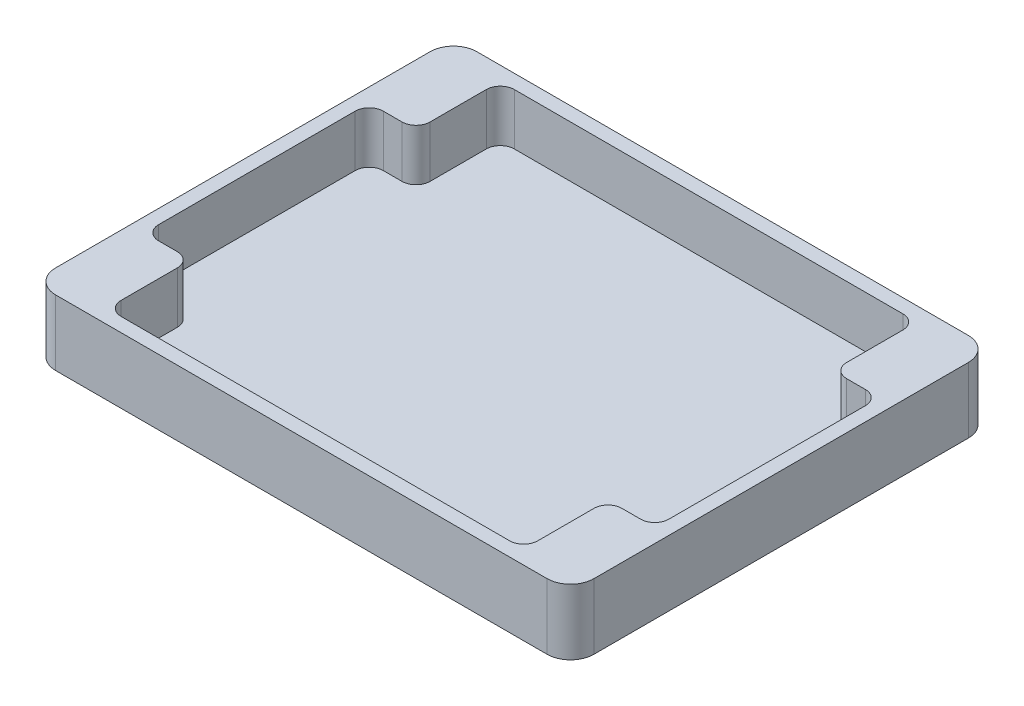
ISO-10303-21;
HEADER;
FILE_DESCRIPTION(('STEP AP214'),'2;1');
FILE_NAME('part.step','',(''),(''),'','','');
FILE_SCHEMA(('AUTOMOTIVE_DESIGN { 1 0 10303 214 1 1 1 1 }'));
ENDSEC;
DATA;
#1=APPLICATION_CONTEXT('core data for automotive mechanical design processes');
#2=APPLICATION_PROTOCOL_DEFINITION('international standard','automotive_design',2000,#1);
#3=PRODUCT_CONTEXT('',#1,'mechanical');
#4=PRODUCT('Part','Part','',(#3));
#5=PRODUCT_RELATED_PRODUCT_CATEGORY('part','',(#4));
#6=PRODUCT_DEFINITION_FORMATION('','',#4);
#7=PRODUCT_DEFINITION_CONTEXT('part definition',#1,'design');
#8=PRODUCT_DEFINITION('design','',#6,#7);
#9=PRODUCT_DEFINITION_SHAPE('','',#8);
#10=(LENGTH_UNIT() NAMED_UNIT(*) SI_UNIT(.MILLI.,.METRE.));
#11=(NAMED_UNIT(*) PLANE_ANGLE_UNIT() SI_UNIT($,.RADIAN.));
#12=(NAMED_UNIT(*) SI_UNIT($,.STERADIAN.) SOLID_ANGLE_UNIT());
#13=UNCERTAINTY_MEASURE_WITH_UNIT(LENGTH_MEASURE(1.E-05),#10,'distance_accuracy_value','');
#14=(GEOMETRIC_REPRESENTATION_CONTEXT(3) GLOBAL_UNCERTAINTY_ASSIGNED_CONTEXT((#13)) GLOBAL_UNIT_ASSIGNED_CONTEXT((#10,
#11,#12)) REPRESENTATION_CONTEXT('',''));
#15=CARTESIAN_POINT('',(0.,0.,0.));
#16=DIRECTION('',(0.,0.,1.));
#17=DIRECTION('',(1.,0.,0.));
#18=AXIS2_PLACEMENT_3D('',#15,#16,#17);
#19=CARTESIAN_POINT('',(0.,3.,0.));
#20=DIRECTION('',(0.,-1.,0.));
#21=DIRECTION('',(0.,0.,-1.));
#22=AXIS2_PLACEMENT_3D('',#19,#20,#21);
#23=PLANE('',#22);
#24=DIRECTION('',(-1.,0.,0.));
#25=VECTOR('',#24,1.);
#26=CARTESIAN_POINT('',(112.,3.,-21.));
#27=LINE('',#26,#25);
#28=CARTESIAN_POINT('',(109.,3.,-21.));
#29=VERTEX_POINT('',#28);
#30=CARTESIAN_POINT('',(105.,3.,-21.));
#31=VERTEX_POINT('',#30);
#32=EDGE_CURVE('E268',#29,#31,#27,.T.);
#33=ORIENTED_EDGE('',*,*,#32,.F.);
#34=CARTESIAN_POINT('',(109.,3.,-24.));
#35=DIRECTION('',(0.,-1.,0.));
#36=DIRECTION('',(0.,0.,-1.));
#37=AXIS2_PLACEMENT_3D('',#34,#35,#36);
#38=CIRCLE('',#37,3.);
#39=CARTESIAN_POINT('',(112.,3.,-24.));
#40=VERTEX_POINT('',#39);
#41=EDGE_CURVE('E507',#29,#40,#38,.F.);
#42=ORIENTED_EDGE('',*,*,#41,.T.);
#43=DIRECTION('',(0.,0.,-1.));
#44=VECTOR('',#43,1.);
#45=CARTESIAN_POINT('',(112.,3.,-3.));
#46=LINE('',#45,#44);
#47=CARTESIAN_POINT('',(112.,3.,-66.));
#48=VERTEX_POINT('',#47);
#49=EDGE_CURVE('E580',#40,#48,#46,.T.);
#50=ORIENTED_EDGE('',*,*,#49,.T.);
#51=CARTESIAN_POINT('',(109.,3.,-66.));
#52=DIRECTION('',(0.,-1.,0.));
#53=DIRECTION('',(0.,0.,-1.));
#54=AXIS2_PLACEMENT_3D('',#51,#52,#53);
#55=CIRCLE('',#54,3.);
#56=CARTESIAN_POINT('',(109.,3.,-69.));
#57=VERTEX_POINT('',#56);
#58=EDGE_CURVE('E495',#48,#57,#55,.F.);
#59=ORIENTED_EDGE('',*,*,#58,.T.);
#60=DIRECTION('',(1.,0.,0.));
#61=VECTOR('',#60,1.);
#62=CARTESIAN_POINT('',(112.,3.,-69.));
#63=LINE('',#62,#61);
#64=CARTESIAN_POINT('',(105.,3.,-69.));
#65=VERTEX_POINT('',#64);
#66=EDGE_CURVE('E542',#65,#57,#63,.T.);
#67=ORIENTED_EDGE('',*,*,#66,.F.);
#68=CARTESIAN_POINT('',(105.,3.,-72.));
#69=DIRECTION('',(0.,-1.,0.));
#70=DIRECTION('',(0.,0.,-1.));
#71=AXIS2_PLACEMENT_3D('',#68,#69,#70);
#72=CIRCLE('',#71,3.);
#73=CARTESIAN_POINT('',(102.,3.,-72.));
#74=VERTEX_POINT('',#73);
#75=EDGE_CURVE('E382',#65,#74,#72,.T.);
#76=ORIENTED_EDGE('',*,*,#75,.T.);
#77=DIRECTION('',(0.,0.,1.));
#78=VECTOR('',#77,1.);
#79=CARTESIAN_POINT('',(102.,3.,-87.));
#80=LINE('',#79,#78);
#81=CARTESIAN_POINT('',(102.,3.,-84.));
#82=VERTEX_POINT('',#81);
#83=EDGE_CURVE('E548',#82,#74,#80,.T.);
#84=ORIENTED_EDGE('',*,*,#83,.F.);
#85=CARTESIAN_POINT('',(99.,3.,-84.));
#86=DIRECTION('',(0.,-1.,0.));
#87=DIRECTION('',(0.,0.,-1.));
#88=AXIS2_PLACEMENT_3D('',#85,#86,#87);
#89=CIRCLE('',#88,3.);
#90=CARTESIAN_POINT('',(99.,3.,-87.));
#91=VERTEX_POINT('',#90);
#92=EDGE_CURVE('E492',#82,#91,#89,.F.);
#93=ORIENTED_EDGE('',*,*,#92,.T.);
#94=DIRECTION('',(-1.,0.,0.));
#95=VECTOR('',#94,1.);
#96=CARTESIAN_POINT('',(112.,3.,-87.));
#97=LINE('',#96,#95);
#98=CARTESIAN_POINT('',(16.,3.,-87.));
#99=VERTEX_POINT('',#98);
#100=EDGE_CURVE('E595',#91,#99,#97,.T.);
#101=ORIENTED_EDGE('',*,*,#100,.T.);
#102=CARTESIAN_POINT('',(16.,3.,-84.));
#103=DIRECTION('',(0.,-1.,0.));
#104=DIRECTION('',(0.,0.,-1.));
#105=AXIS2_PLACEMENT_3D('',#102,#103,#104);
#106=CIRCLE('',#105,3.);
#107=CARTESIAN_POINT('',(13.,3.,-84.));
#108=VERTEX_POINT('',#107);
#109=EDGE_CURVE('E489',#99,#108,#106,.F.);
#110=ORIENTED_EDGE('',*,*,#109,.T.);
#111=DIRECTION('',(0.,0.,-1.));
#112=VECTOR('',#111,1.);
#113=CARTESIAN_POINT('',(13.,3.,-87.));
#114=LINE('',#113,#112);
#115=CARTESIAN_POINT('',(13.,3.,-72.));
#116=VERTEX_POINT('',#115);
#117=EDGE_CURVE('E558',#116,#108,#114,.T.);
#118=ORIENTED_EDGE('',*,*,#117,.F.);
#119=CARTESIAN_POINT('',(10.,3.,-72.));
#120=DIRECTION('',(0.,-1.,0.));
#121=DIRECTION('',(0.,0.,-1.));
#122=AXIS2_PLACEMENT_3D('',#119,#120,#121);
#123=CIRCLE('',#122,3.);
#124=CARTESIAN_POINT('',(10.,3.,-69.));
#125=VERTEX_POINT('',#124);
#126=EDGE_CURVE('E394',#116,#125,#123,.T.);
#127=ORIENTED_EDGE('',*,*,#126,.T.);
#128=DIRECTION('',(1.,0.,0.));
#129=VECTOR('',#128,1.);
#130=CARTESIAN_POINT('',(3.,3.,-69.));
#131=LINE('',#130,#129);
#132=CARTESIAN_POINT('',(6.,3.,-69.));
#133=VERTEX_POINT('',#132);
#134=EDGE_CURVE('E553',#133,#125,#131,.T.);
#135=ORIENTED_EDGE('',*,*,#134,.F.);
#136=CARTESIAN_POINT('',(6.,3.,-66.));
#137=DIRECTION('',(0.,-1.,0.));
#138=DIRECTION('',(0.,0.,-1.));
#139=AXIS2_PLACEMENT_3D('',#136,#137,#138);
#140=CIRCLE('',#139,3.);
#141=CARTESIAN_POINT('',(3.,3.,-66.));
#142=VERTEX_POINT('',#141);
#143=EDGE_CURVE('E486',#133,#142,#140,.F.);
#144=ORIENTED_EDGE('',*,*,#143,.T.);
#145=DIRECTION('',(0.,0.,1.));
#146=VECTOR('',#145,1.);
#147=CARTESIAN_POINT('',(3.,3.,-87.));
#148=LINE('',#147,#146);
#149=CARTESIAN_POINT('',(3.,3.,-24.));
#150=VERTEX_POINT('',#149);
#151=EDGE_CURVE('E599',#142,#150,#148,.T.);
#152=ORIENTED_EDGE('',*,*,#151,.T.);
#153=CARTESIAN_POINT('',(6.,3.,-24.));
#154=DIRECTION('',(0.,-1.,0.));
#155=DIRECTION('',(0.,0.,-1.));
#156=AXIS2_PLACEMENT_3D('',#153,#154,#155);
#157=CIRCLE('',#156,3.);
#158=CARTESIAN_POINT('',(6.,3.,-21.));
#159=VERTEX_POINT('',#158);
#160=EDGE_CURVE('E498',#150,#159,#157,.F.);
#161=ORIENTED_EDGE('',*,*,#160,.T.);
#162=DIRECTION('',(-1.,0.,0.));
#163=VECTOR('',#162,1.);
#164=CARTESIAN_POINT('',(3.,3.,-21.));
#165=LINE('',#164,#163);
#166=CARTESIAN_POINT('',(10.,3.,-21.));
#167=VERTEX_POINT('',#166);
#168=EDGE_CURVE('E733',#167,#159,#165,.T.);
#169=ORIENTED_EDGE('',*,*,#168,.F.);
#170=CARTESIAN_POINT('',(10.,3.,-18.));
#171=DIRECTION('',(0.,-1.,0.));
#172=DIRECTION('',(0.,0.,-1.));
#173=AXIS2_PLACEMENT_3D('',#170,#171,#172);
#174=CIRCLE('',#173,3.);
#175=CARTESIAN_POINT('',(13.,3.,-18.));
#176=VERTEX_POINT('',#175);
#177=EDGE_CURVE('E376',#167,#176,#174,.T.);
#178=ORIENTED_EDGE('',*,*,#177,.T.);
#179=DIRECTION('',(0.,0.,-1.));
#180=VECTOR('',#179,1.);
#181=CARTESIAN_POINT('',(13.,3.,-3.));
#182=LINE('',#181,#180);
#183=CARTESIAN_POINT('',(13.,3.,-6.));
#184=VERTEX_POINT('',#183);
#185=EDGE_CURVE('E285',#184,#176,#182,.T.);
#186=ORIENTED_EDGE('',*,*,#185,.F.);
#187=CARTESIAN_POINT('',(16.,3.,-6.));
#188=DIRECTION('',(0.,-1.,0.));
#189=DIRECTION('',(0.,0.,-1.));
#190=AXIS2_PLACEMENT_3D('',#187,#188,#189);
#191=CIRCLE('',#190,3.);
#192=CARTESIAN_POINT('',(16.,3.,-3.));
#193=VERTEX_POINT('',#192);
#194=EDGE_CURVE('E501',#184,#193,#191,.F.);
#195=ORIENTED_EDGE('',*,*,#194,.T.);
#196=DIRECTION('',(1.,0.,0.));
#197=VECTOR('',#196,1.);
#198=CARTESIAN_POINT('',(3.,3.,-3.));
#199=LINE('',#198,#197);
#200=CARTESIAN_POINT('',(99.,3.,-3.));
#201=VERTEX_POINT('',#200);
#202=EDGE_CURVE('E478',#193,#201,#199,.T.);
#203=ORIENTED_EDGE('',*,*,#202,.T.);
#204=CARTESIAN_POINT('',(99.,3.,-6.));
#205=DIRECTION('',(0.,-1.,0.));
#206=DIRECTION('',(0.,0.,-1.));
#207=AXIS2_PLACEMENT_3D('',#204,#205,#206);
#208=CIRCLE('',#207,3.);
#209=CARTESIAN_POINT('',(102.,3.,-6.));
#210=VERTEX_POINT('',#209);
#211=EDGE_CURVE('E504',#201,#210,#208,.F.);
#212=ORIENTED_EDGE('',*,*,#211,.T.);
#213=DIRECTION('',(0.,0.,1.));
#214=VECTOR('',#213,1.);
#215=CARTESIAN_POINT('',(102.,3.,-3.));
#216=LINE('',#215,#214);
#217=CARTESIAN_POINT('',(102.,3.,-18.));
#218=VERTEX_POINT('',#217);
#219=EDGE_CURVE('E754',#218,#210,#216,.T.);
#220=ORIENTED_EDGE('',*,*,#219,.F.);
#221=CARTESIAN_POINT('',(105.,3.,-18.));
#222=DIRECTION('',(0.,-1.,0.));
#223=DIRECTION('',(0.,0.,-1.));
#224=AXIS2_PLACEMENT_3D('',#221,#222,#223);
#225=CIRCLE('',#224,3.);
#226=EDGE_CURVE('E364',#218,#31,#225,.T.);
#227=ORIENTED_EDGE('',*,*,#226,.T.);
#228=EDGE_LOOP('',(#33,#42,#50,#59,#67,#76,#84,#93,#101,#110,#118,#127,#135,#144,#152,#161,#169,
#178,#186,#195,#203,#212,#220,#227));
#229=FACE_BOUND('',#228,.T.);
#230=ADVANCED_FACE('F49',(#229),#23,.F.);
#231=CARTESIAN_POINT('',(3.,-137.611772752189,-3.));
#232=DIRECTION('',(0.,0.,1.));
#233=DIRECTION('',(1.,0.,0.));
#234=AXIS2_PLACEMENT_3D('',#231,#232,#233);
#235=PLANE('',#234);
#236=DIRECTION('',(1.,0.,0.));
#237=VECTOR('',#236,1.);
#238=CARTESIAN_POINT('',(3.,14.,-3.));
#239=LINE('',#238,#237);
#240=CARTESIAN_POINT('',(16.,14.,-3.));
#241=VERTEX_POINT('',#240);
#242=CARTESIAN_POINT('',(99.,14.,-3.));
#243=VERTEX_POINT('',#242);
#244=EDGE_CURVE('E571',#241,#243,#239,.T.);
#245=ORIENTED_EDGE('',*,*,#244,.T.);
#246=DIRECTION('',(0.,-1.,0.));
#247=VECTOR('',#246,1.);
#248=CARTESIAN_POINT('',(99.,3.,-3.));
#249=LINE('',#248,#247);
#250=EDGE_CURVE('E297',#243,#201,#249,.T.);
#251=ORIENTED_EDGE('',*,*,#250,.T.);
#252=ORIENTED_EDGE('',*,*,#202,.F.);
#253=DIRECTION('',(0.,-1.,0.));
#254=VECTOR('',#253,1.);
#255=CARTESIAN_POINT('',(16.,14.,-3.));
#256=LINE('',#255,#254);
#257=EDGE_CURVE('E292',#193,#241,#256,.F.);
#258=ORIENTED_EDGE('',*,*,#257,.T.);
#259=EDGE_LOOP('',(#245,#251,#252,#258));
#260=FACE_BOUND('',#259,.T.);
#261=ADVANCED_FACE('F638',(#260),#235,.F.);
#262=CARTESIAN_POINT('',(3.,-137.611772752189,-87.));
#263=DIRECTION('',(-1.,0.,0.));
#264=DIRECTION('',(0.,0.,1.));
#265=AXIS2_PLACEMENT_3D('',#262,#263,#264);
#266=PLANE('',#265);
#267=DIRECTION('',(0.,0.,1.));
#268=VECTOR('',#267,1.);
#269=CARTESIAN_POINT('',(3.,14.,-87.));
#270=LINE('',#269,#268);
#271=CARTESIAN_POINT('',(3.,14.,-66.));
#272=VERTEX_POINT('',#271);
#273=CARTESIAN_POINT('',(3.,14.,-24.));
#274=VERTEX_POINT('',#273);
#275=EDGE_CURVE('E576',#272,#274,#270,.T.);
#276=ORIENTED_EDGE('',*,*,#275,.T.);
#277=DIRECTION('',(0.,-1.,0.));
#278=VECTOR('',#277,1.);
#279=CARTESIAN_POINT('',(3.,3.,-24.));
#280=LINE('',#279,#278);
#281=EDGE_CURVE('E316',#274,#150,#280,.T.);
#282=ORIENTED_EDGE('',*,*,#281,.T.);
#283=ORIENTED_EDGE('',*,*,#151,.F.);
#284=DIRECTION('',(0.,-1.,0.));
#285=VECTOR('',#284,1.);
#286=CARTESIAN_POINT('',(3.,14.,-66.));
#287=LINE('',#286,#285);
#288=EDGE_CURVE('E313',#142,#272,#287,.F.);
#289=ORIENTED_EDGE('',*,*,#288,.T.);
#290=EDGE_LOOP('',(#276,#282,#283,#289));
#291=FACE_BOUND('',#290,.T.);
#292=ADVANCED_FACE('F643',(#291),#266,.F.);
#293=CARTESIAN_POINT('',(112.,-137.611772752189,-3.));
#294=DIRECTION('',(1.,0.,0.));
#295=DIRECTION('',(0.,0.,-1.));
#296=AXIS2_PLACEMENT_3D('',#293,#294,#295);
#297=PLANE('',#296);
#298=ORIENTED_EDGE('',*,*,#49,.F.);
#299=DIRECTION('',(0.,-1.,0.));
#300=VECTOR('',#299,1.);
#301=CARTESIAN_POINT('',(112.,14.,-24.));
#302=LINE('',#301,#300);
#303=CARTESIAN_POINT('',(112.,14.,-24.));
#304=VERTEX_POINT('',#303);
#305=EDGE_CURVE('E514',#40,#304,#302,.F.);
#306=ORIENTED_EDGE('',*,*,#305,.T.);
#307=DIRECTION('',(0.,0.,-1.));
#308=VECTOR('',#307,1.);
#309=CARTESIAN_POINT('',(112.,14.,-3.));
#310=LINE('',#309,#308);
#311=CARTESIAN_POINT('',(112.,14.,-66.));
#312=VERTEX_POINT('',#311);
#313=EDGE_CURVE('E585',#304,#312,#310,.T.);
#314=ORIENTED_EDGE('',*,*,#313,.T.);
#315=DIRECTION('',(0.,-1.,0.));
#316=VECTOR('',#315,1.);
#317=CARTESIAN_POINT('',(112.,3.,-66.));
#318=LINE('',#317,#316);
#319=EDGE_CURVE('E510',#312,#48,#318,.T.);
#320=ORIENTED_EDGE('',*,*,#319,.T.);
#321=EDGE_LOOP('',(#298,#306,#314,#320));
#322=FACE_BOUND('',#321,.T.);
#323=ADVANCED_FACE('F648',(#322),#297,.F.);
#324=CARTESIAN_POINT('',(112.,-137.611772752189,-87.));
#325=DIRECTION('',(0.,0.,-1.));
#326=DIRECTION('',(-1.,0.,0.));
#327=AXIS2_PLACEMENT_3D('',#324,#325,#326);
#328=PLANE('',#327);
#329=ORIENTED_EDGE('',*,*,#100,.F.);
#330=DIRECTION('',(0.,-1.,0.));
#331=VECTOR('',#330,1.);
#332=CARTESIAN_POINT('',(99.,14.,-87.));
#333=LINE('',#332,#331);
#334=CARTESIAN_POINT('',(99.,14.,-87.));
#335=VERTEX_POINT('',#334);
#336=EDGE_CURVE('E345',#91,#335,#333,.F.);
#337=ORIENTED_EDGE('',*,*,#336,.T.);
#338=DIRECTION('',(-1.,0.,0.));
#339=VECTOR('',#338,1.);
#340=CARTESIAN_POINT('',(112.,14.,-87.));
#341=LINE('',#340,#339);
#342=CARTESIAN_POINT('',(16.,14.,-87.));
#343=VERTEX_POINT('',#342);
#344=EDGE_CURVE('E581',#335,#343,#341,.T.);
#345=ORIENTED_EDGE('',*,*,#344,.T.);
#346=DIRECTION('',(0.,-1.,0.));
#347=VECTOR('',#346,1.);
#348=CARTESIAN_POINT('',(16.,3.,-87.));
#349=LINE('',#348,#347);
#350=EDGE_CURVE('E341',#343,#99,#349,.T.);
#351=ORIENTED_EDGE('',*,*,#350,.T.);
#352=EDGE_LOOP('',(#329,#337,#345,#351));
#353=FACE_BOUND('',#352,.T.);
#354=ADVANCED_FACE('F662',(#353),#328,.F.);
#355=CARTESIAN_POINT('',(0.,14.,0.));
#356=DIRECTION('',(1.,0.,0.));
#357=DIRECTION('',(0.,0.,-1.));
#358=AXIS2_PLACEMENT_3D('',#355,#356,#357);
#359=PLANE('',#358);
#360=DIRECTION('',(0.,0.,1.));
#361=VECTOR('',#360,1.);
#362=CARTESIAN_POINT('',(0.,0.,0.));
#363=LINE('',#362,#361);
#364=CARTESIAN_POINT('',(0.,0.,-85.));
#365=VERTEX_POINT('',#364);
#366=CARTESIAN_POINT('',(0.,0.,-5.));
#367=VERTEX_POINT('',#366);
#368=EDGE_CURVE('E450',#365,#367,#363,.T.);
#369=ORIENTED_EDGE('',*,*,#368,.T.);
#370=DIRECTION('',(0.,-1.,0.));
#371=VECTOR('',#370,1.);
#372=CARTESIAN_POINT('',(0.,14.,-5.));
#373=LINE('',#372,#371);
#374=CARTESIAN_POINT('',(0.,14.,-5.));
#375=VERTEX_POINT('',#374);
#376=EDGE_CURVE('E438',#367,#375,#373,.F.);
#377=ORIENTED_EDGE('',*,*,#376,.T.);
#378=DIRECTION('',(0.,0.,1.));
#379=VECTOR('',#378,1.);
#380=CARTESIAN_POINT('',(0.,14.,0.));
#381=LINE('',#380,#379);
#382=CARTESIAN_POINT('',(0.,14.,-85.));
#383=VERTEX_POINT('',#382);
#384=EDGE_CURVE('E447',#383,#375,#381,.T.);
#385=ORIENTED_EDGE('',*,*,#384,.F.);
#386=DIRECTION('',(0.,-1.,0.));
#387=VECTOR('',#386,1.);
#388=CARTESIAN_POINT('',(0.,14.,-85.));
#389=LINE('',#388,#387);
#390=EDGE_CURVE('E434',#383,#365,#389,.T.);
#391=ORIENTED_EDGE('',*,*,#390,.T.);
#392=EDGE_LOOP('',(#369,#377,#385,#391));
#393=FACE_BOUND('',#392,.T.);
#394=ADVANCED_FACE('F446',(#393),#359,.F.);
#395=CARTESIAN_POINT('',(0.,14.,0.));
#396=DIRECTION('',(0.,0.,-1.));
#397=DIRECTION('',(-1.,0.,0.));
#398=AXIS2_PLACEMENT_3D('',#395,#396,#397);
#399=PLANE('',#398);
#400=DIRECTION('',(1.,0.,0.));
#401=VECTOR('',#400,1.);
#402=CARTESIAN_POINT('',(0.,0.,0.));
#403=LINE('',#402,#401);
#404=CARTESIAN_POINT('',(5.,0.,0.));
#405=VERTEX_POINT('',#404);
#406=CARTESIAN_POINT('',(110.,0.,0.));
#407=VERTEX_POINT('',#406);
#408=EDGE_CURVE('E466',#405,#407,#403,.T.);
#409=ORIENTED_EDGE('',*,*,#408,.T.);
#410=DIRECTION('',(0.,-1.,0.));
#411=VECTOR('',#410,1.);
#412=CARTESIAN_POINT('',(110.,14.,0.));
#413=LINE('',#412,#411);
#414=CARTESIAN_POINT('',(110.,14.,0.));
#415=VERTEX_POINT('',#414);
#416=EDGE_CURVE('E420',#407,#415,#413,.F.);
#417=ORIENTED_EDGE('',*,*,#416,.T.);
#418=DIRECTION('',(1.,0.,0.));
#419=VECTOR('',#418,1.);
#420=CARTESIAN_POINT('',(0.,14.,0.));
#421=LINE('',#420,#419);
#422=CARTESIAN_POINT('',(5.,14.,0.));
#423=VERTEX_POINT('',#422);
#424=EDGE_CURVE('E457',#423,#415,#421,.T.);
#425=ORIENTED_EDGE('',*,*,#424,.F.);
#426=DIRECTION('',(0.,-1.,0.));
#427=VECTOR('',#426,1.);
#428=CARTESIAN_POINT('',(5.,14.,0.));
#429=LINE('',#428,#427);
#430=EDGE_CURVE('E416',#423,#405,#429,.T.);
#431=ORIENTED_EDGE('',*,*,#430,.T.);
#432=EDGE_LOOP('',(#409,#417,#425,#431));
#433=FACE_BOUND('',#432,.T.);
#434=ADVANCED_FACE('F465',(#433),#399,.F.);
#435=CARTESIAN_POINT('',(115.,14.,0.));
#436=DIRECTION('',(-1.,0.,0.));
#437=DIRECTION('',(0.,0.,1.));
#438=AXIS2_PLACEMENT_3D('',#435,#436,#437);
#439=PLANE('',#438);
#440=DIRECTION('',(0.,0.,-1.));
#441=VECTOR('',#440,1.);
#442=CARTESIAN_POINT('',(115.,14.,0.));
#443=LINE('',#442,#441);
#444=CARTESIAN_POINT('',(115.,14.,-5.));
#445=VERTEX_POINT('',#444);
#446=CARTESIAN_POINT('',(115.,14.,-85.));
#447=VERTEX_POINT('',#446);
#448=EDGE_CURVE('E608',#445,#447,#443,.T.);
#449=ORIENTED_EDGE('',*,*,#448,.F.);
#450=DIRECTION('',(0.,-1.,0.));
#451=VECTOR('',#450,1.);
#452=CARTESIAN_POINT('',(115.,14.,-5.));
#453=LINE('',#452,#451);
#454=CARTESIAN_POINT('',(115.,0.,-5.));
#455=VERTEX_POINT('',#454);
#456=EDGE_CURVE('E400',#445,#455,#453,.T.);
#457=ORIENTED_EDGE('',*,*,#456,.T.);
#458=DIRECTION('',(0.,0.,-1.));
#459=VECTOR('',#458,1.);
#460=CARTESIAN_POINT('',(115.,0.,0.));
#461=LINE('',#460,#459);
#462=CARTESIAN_POINT('',(115.,0.,-85.));
#463=VERTEX_POINT('',#462);
#464=EDGE_CURVE('E472',#455,#463,#461,.T.);
#465=ORIENTED_EDGE('',*,*,#464,.T.);
#466=DIRECTION('',(0.,-1.,0.));
#467=VECTOR('',#466,1.);
#468=CARTESIAN_POINT('',(115.,14.,-85.));
#469=LINE('',#468,#467);
#470=EDGE_CURVE('E397',#463,#447,#469,.F.);
#471=ORIENTED_EDGE('',*,*,#470,.T.);
#472=EDGE_LOOP('',(#449,#457,#465,#471));
#473=FACE_BOUND('',#472,.T.);
#474=ADVANCED_FACE('F620',(#473),#439,.F.);
#475=CARTESIAN_POINT('',(0.,14.,-90.));
#476=DIRECTION('',(0.,0.,1.));
#477=DIRECTION('',(1.,0.,0.));
#478=AXIS2_PLACEMENT_3D('',#475,#476,#477);
#479=PLANE('',#478);
#480=DIRECTION('',(-1.,0.,0.));
#481=VECTOR('',#480,1.);
#482=CARTESIAN_POINT('',(0.,14.,-90.));
#483=LINE('',#482,#481);
#484=CARTESIAN_POINT('',(110.,14.,-90.));
#485=VERTEX_POINT('',#484);
#486=CARTESIAN_POINT('',(5.,14.,-90.));
#487=VERTEX_POINT('',#486);
#488=EDGE_CURVE('E273',#485,#487,#483,.T.);
#489=ORIENTED_EDGE('',*,*,#488,.F.);
#490=DIRECTION('',(0.,-1.,0.));
#491=VECTOR('',#490,1.);
#492=CARTESIAN_POINT('',(110.,14.,-90.));
#493=LINE('',#492,#491);
#494=CARTESIAN_POINT('',(110.,0.,-90.));
#495=VERTEX_POINT('',#494);
#496=EDGE_CURVE('E12',#485,#495,#493,.T.);
#497=ORIENTED_EDGE('',*,*,#496,.T.);
#498=DIRECTION('',(-1.,0.,0.));
#499=VECTOR('',#498,1.);
#500=CARTESIAN_POINT('',(0.,0.,-90.));
#501=LINE('',#500,#499);
#502=CARTESIAN_POINT('',(5.,0.,-90.));
#503=VERTEX_POINT('',#502);
#504=EDGE_CURVE('E458',#495,#503,#501,.T.);
#505=ORIENTED_EDGE('',*,*,#504,.T.);
#506=DIRECTION('',(0.,-1.,0.));
#507=VECTOR('',#506,1.);
#508=CARTESIAN_POINT('',(5.,14.,-90.));
#509=LINE('',#508,#507);
#510=EDGE_CURVE('E58',#503,#487,#509,.F.);
#511=ORIENTED_EDGE('',*,*,#510,.T.);
#512=EDGE_LOOP('',(#489,#497,#505,#511));
#513=FACE_BOUND('',#512,.T.);
#514=ADVANCED_FACE('F614',(#513),#479,.F.);
#515=CARTESIAN_POINT('',(0.,14.,0.));
#516=DIRECTION('',(0.,-1.,0.));
#517=DIRECTION('',(0.,0.,-1.));
#518=AXIS2_PLACEMENT_3D('',#515,#516,#517);
#519=PLANE('',#518);
#520=DIRECTION('',(1.,0.,0.));
#521=VECTOR('',#520,1.);
#522=CARTESIAN_POINT('',(112.,14.,-21.));
#523=LINE('',#522,#521);
#524=CARTESIAN_POINT('',(105.,14.,-21.));
#525=VERTEX_POINT('',#524);
#526=CARTESIAN_POINT('',(109.,14.,-21.));
#527=VERTEX_POINT('',#526);
#528=EDGE_CURVE('E265',#525,#527,#523,.T.);
#529=ORIENTED_EDGE('',*,*,#528,.F.);
#530=CARTESIAN_POINT('',(105.,14.,-18.));
#531=DIRECTION('',(0.,-1.,0.));
#532=DIRECTION('',(0.,0.,-1.));
#533=AXIS2_PLACEMENT_3D('',#530,#531,#532);
#534=CIRCLE('',#533,3.);
#535=CARTESIAN_POINT('',(102.,14.,-18.));
#536=VERTEX_POINT('',#535);
#537=EDGE_CURVE('E278',#525,#536,#534,.F.);
#538=ORIENTED_EDGE('',*,*,#537,.T.);
#539=DIRECTION('',(0.,0.,-1.));
#540=VECTOR('',#539,1.);
#541=CARTESIAN_POINT('',(102.,14.,-3.));
#542=LINE('',#541,#540);
#543=CARTESIAN_POINT('',(102.,14.,-6.));
#544=VERTEX_POINT('',#543);
#545=EDGE_CURVE('E284',#544,#536,#542,.T.);
#546=ORIENTED_EDGE('',*,*,#545,.F.);
#547=CARTESIAN_POINT('',(99.,14.,-6.));
#548=DIRECTION('',(0.,-1.,0.));
#549=DIRECTION('',(0.,0.,-1.));
#550=AXIS2_PLACEMENT_3D('',#547,#548,#549);
#551=CIRCLE('',#550,3.);
#552=EDGE_CURVE('E367',#544,#243,#551,.T.);
#553=ORIENTED_EDGE('',*,*,#552,.T.);
#554=ORIENTED_EDGE('',*,*,#244,.F.);
#555=CARTESIAN_POINT('',(16.,14.,-6.));
#556=DIRECTION('',(0.,-1.,0.));
#557=DIRECTION('',(0.,0.,-1.));
#558=AXIS2_PLACEMENT_3D('',#555,#556,#557);
#559=CIRCLE('',#558,3.);
#560=CARTESIAN_POINT('',(13.,14.,-6.));
#561=VERTEX_POINT('',#560);
#562=EDGE_CURVE('E370',#241,#561,#559,.T.);
#563=ORIENTED_EDGE('',*,*,#562,.T.);
#564=DIRECTION('',(0.,0.,1.));
#565=VECTOR('',#564,1.);
#566=CARTESIAN_POINT('',(13.,14.,-3.));
#567=LINE('',#566,#565);
#568=CARTESIAN_POINT('',(13.,14.,-18.));
#569=VERTEX_POINT('',#568);
#570=EDGE_CURVE('E746',#569,#561,#567,.T.);
#571=ORIENTED_EDGE('',*,*,#570,.F.);
#572=CARTESIAN_POINT('',(10.,14.,-18.));
#573=DIRECTION('',(0.,-1.,0.));
#574=DIRECTION('',(0.,0.,-1.));
#575=AXIS2_PLACEMENT_3D('',#572,#573,#574);
#576=CIRCLE('',#575,3.);
#577=CARTESIAN_POINT('',(10.,14.,-21.));
#578=VERTEX_POINT('',#577);
#579=EDGE_CURVE('E293',#569,#578,#576,.F.);
#580=ORIENTED_EDGE('',*,*,#579,.T.);
#581=DIRECTION('',(1.,0.,0.));
#582=VECTOR('',#581,1.);
#583=CARTESIAN_POINT('',(3.,14.,-21.));
#584=LINE('',#583,#582);
#585=CARTESIAN_POINT('',(6.,14.,-21.));
#586=VERTEX_POINT('',#585);
#587=EDGE_CURVE('E740',#586,#578,#584,.T.);
#588=ORIENTED_EDGE('',*,*,#587,.F.);
#589=CARTESIAN_POINT('',(6.,14.,-24.));
#590=DIRECTION('',(0.,-1.,0.));
#591=DIRECTION('',(0.,0.,-1.));
#592=AXIS2_PLACEMENT_3D('',#589,#590,#591);
#593=CIRCLE('',#592,3.);
#594=EDGE_CURVE('E373',#586,#274,#593,.T.);
#595=ORIENTED_EDGE('',*,*,#594,.T.);
#596=ORIENTED_EDGE('',*,*,#275,.F.);
#597=CARTESIAN_POINT('',(6.,14.,-66.));
#598=DIRECTION('',(0.,-1.,0.));
#599=DIRECTION('',(0.,0.,-1.));
#600=AXIS2_PLACEMENT_3D('',#597,#598,#599);
#601=CIRCLE('',#600,3.);
#602=CARTESIAN_POINT('',(6.,14.,-69.));
#603=VERTEX_POINT('',#602);
#604=EDGE_CURVE('E391',#272,#603,#601,.T.);
#605=ORIENTED_EDGE('',*,*,#604,.T.);
#606=DIRECTION('',(-1.,0.,0.));
#607=VECTOR('',#606,1.);
#608=CARTESIAN_POINT('',(3.,14.,-69.));
#609=LINE('',#608,#607);
#610=CARTESIAN_POINT('',(10.,14.,-69.));
#611=VERTEX_POINT('',#610);
#612=EDGE_CURVE('E568',#611,#603,#609,.T.);
#613=ORIENTED_EDGE('',*,*,#612,.F.);
#614=CARTESIAN_POINT('',(10.,14.,-72.));
#615=DIRECTION('',(0.,-1.,0.));
#616=DIRECTION('',(0.,0.,-1.));
#617=AXIS2_PLACEMENT_3D('',#614,#615,#616);
#618=CIRCLE('',#617,3.);
#619=CARTESIAN_POINT('',(13.,14.,-72.));
#620=VERTEX_POINT('',#619);
#621=EDGE_CURVE('E522',#611,#620,#618,.F.);
#622=ORIENTED_EDGE('',*,*,#621,.T.);
#623=DIRECTION('',(0.,0.,1.));
#624=VECTOR('',#623,1.);
#625=CARTESIAN_POINT('',(13.,14.,-87.));
#626=LINE('',#625,#624);
#627=CARTESIAN_POINT('',(13.,14.,-84.));
#628=VERTEX_POINT('',#627);
#629=EDGE_CURVE('E564',#628,#620,#626,.T.);
#630=ORIENTED_EDGE('',*,*,#629,.F.);
#631=CARTESIAN_POINT('',(16.,14.,-84.));
#632=DIRECTION('',(0.,-1.,0.));
#633=DIRECTION('',(0.,0.,-1.));
#634=AXIS2_PLACEMENT_3D('',#631,#632,#633);
#635=CIRCLE('',#634,3.);
#636=EDGE_CURVE('E388',#628,#343,#635,.T.);
#637=ORIENTED_EDGE('',*,*,#636,.T.);
#638=ORIENTED_EDGE('',*,*,#344,.F.);
#639=CARTESIAN_POINT('',(99.,14.,-84.));
#640=DIRECTION('',(0.,-1.,0.));
#641=DIRECTION('',(0.,0.,-1.));
#642=AXIS2_PLACEMENT_3D('',#639,#640,#641);
#643=CIRCLE('',#642,3.);
#644=CARTESIAN_POINT('',(102.,14.,-84.));
#645=VERTEX_POINT('',#644);
#646=EDGE_CURVE('E385',#335,#645,#643,.T.);
#647=ORIENTED_EDGE('',*,*,#646,.T.);
#648=DIRECTION('',(0.,0.,-1.));
#649=VECTOR('',#648,1.);
#650=CARTESIAN_POINT('',(102.,14.,-87.));
#651=LINE('',#650,#649);
#652=CARTESIAN_POINT('',(102.,14.,-72.));
#653=VERTEX_POINT('',#652);
#654=EDGE_CURVE('E532',#653,#645,#651,.T.);
#655=ORIENTED_EDGE('',*,*,#654,.F.);
#656=CARTESIAN_POINT('',(105.,14.,-72.));
#657=DIRECTION('',(0.,-1.,0.));
#658=DIRECTION('',(0.,0.,-1.));
#659=AXIS2_PLACEMENT_3D('',#656,#657,#658);
#660=CIRCLE('',#659,3.);
#661=CARTESIAN_POINT('',(105.,14.,-69.));
#662=VERTEX_POINT('',#661);
#663=EDGE_CURVE('E299',#653,#662,#660,.F.);
#664=ORIENTED_EDGE('',*,*,#663,.T.);
#665=DIRECTION('',(-1.,0.,0.));
#666=VECTOR('',#665,1.);
#667=CARTESIAN_POINT('',(112.,14.,-69.));
#668=LINE('',#667,#666);
#669=CARTESIAN_POINT('',(109.,14.,-69.));
#670=VERTEX_POINT('',#669);
#671=EDGE_CURVE('E529',#670,#662,#668,.T.);
#672=ORIENTED_EDGE('',*,*,#671,.F.);
#673=CARTESIAN_POINT('',(109.,14.,-66.));
#674=DIRECTION('',(0.,-1.,0.));
#675=DIRECTION('',(0.,0.,-1.));
#676=AXIS2_PLACEMENT_3D('',#673,#674,#675);
#677=CIRCLE('',#676,3.);
#678=EDGE_CURVE('E379',#670,#312,#677,.T.);
#679=ORIENTED_EDGE('',*,*,#678,.T.);
#680=ORIENTED_EDGE('',*,*,#313,.F.);
#681=CARTESIAN_POINT('',(109.,14.,-24.));
#682=DIRECTION('',(0.,-1.,0.));
#683=DIRECTION('',(0.,0.,-1.));
#684=AXIS2_PLACEMENT_3D('',#681,#682,#683);
#685=CIRCLE('',#684,3.);
#686=EDGE_CURVE('E282',#304,#527,#685,.T.);
#687=ORIENTED_EDGE('',*,*,#686,.T.);
#688=EDGE_LOOP('',(#529,#538,#546,#553,#554,#563,#571,#580,#588,#595,#596,#605,#613,#622,#630,
#637,#638,#647,#655,#664,#672,#679,#680,#687));
#689=FACE_BOUND('',#688,.T.);
#690=ORIENTED_EDGE('',*,*,#424,.T.);
#691=CARTESIAN_POINT('',(110.,14.,-5.));
#692=DIRECTION('',(0.,-1.,0.));
#693=DIRECTION('',(0.,0.,-1.));
#694=AXIS2_PLACEMENT_3D('',#691,#692,#693);
#695=CIRCLE('',#694,5.);
#696=EDGE_CURVE('E431',#415,#445,#695,.F.);
#697=ORIENTED_EDGE('',*,*,#696,.T.);
#698=ORIENTED_EDGE('',*,*,#448,.T.);
#699=CARTESIAN_POINT('',(110.,14.,-85.));
#700=DIRECTION('',(0.,-1.,0.));
#701=DIRECTION('',(0.,0.,-1.));
#702=AXIS2_PLACEMENT_3D('',#699,#700,#701);
#703=CIRCLE('',#702,5.);
#704=EDGE_CURVE('E71',#447,#485,#703,.F.);
#705=ORIENTED_EDGE('',*,*,#704,.T.);
#706=ORIENTED_EDGE('',*,*,#488,.T.);
#707=CARTESIAN_POINT('',(5.,14.,-85.));
#708=DIRECTION('',(0.,-1.,0.));
#709=DIRECTION('',(0.,0.,-1.));
#710=AXIS2_PLACEMENT_3D('',#707,#708,#709);
#711=CIRCLE('',#710,5.);
#712=EDGE_CURVE('E423',#487,#383,#711,.F.);
#713=ORIENTED_EDGE('',*,*,#712,.T.);
#714=ORIENTED_EDGE('',*,*,#384,.T.);
#715=CARTESIAN_POINT('',(5.,14.,-5.));
#716=DIRECTION('',(0.,-1.,0.));
#717=DIRECTION('',(0.,0.,-1.));
#718=AXIS2_PLACEMENT_3D('',#715,#716,#717);
#719=CIRCLE('',#718,5.);
#720=EDGE_CURVE('E428',#375,#423,#719,.F.);
#721=ORIENTED_EDGE('',*,*,#720,.T.);
#722=EDGE_LOOP('',(#690,#697,#698,#705,#706,#713,#714,#721));
#723=FACE_BOUND('',#722,.T.);
#724=ADVANCED_FACE('F276',(#689,#723),#519,.F.);
#725=CARTESIAN_POINT('',(0.,0.,0.));
#726=DIRECTION('',(0.,-1.,0.));
#727=DIRECTION('',(0.,0.,-1.));
#728=AXIS2_PLACEMENT_3D('',#725,#726,#727);
#729=PLANE('',#728);
#730=ORIENTED_EDGE('',*,*,#464,.F.);
#731=CARTESIAN_POINT('',(110.,0.,-5.));
#732=DIRECTION('',(0.,-1.,0.));
#733=DIRECTION('',(0.,0.,-1.));
#734=AXIS2_PLACEMENT_3D('',#731,#732,#733);
#735=CIRCLE('',#734,5.);
#736=EDGE_CURVE('E413',#455,#407,#735,.T.);
#737=ORIENTED_EDGE('',*,*,#736,.T.);
#738=ORIENTED_EDGE('',*,*,#408,.F.);
#739=CARTESIAN_POINT('',(5.,0.,-5.));
#740=DIRECTION('',(0.,-1.,0.));
#741=DIRECTION('',(0.,0.,-1.));
#742=AXIS2_PLACEMENT_3D('',#739,#740,#741);
#743=CIRCLE('',#742,5.);
#744=EDGE_CURVE('E410',#405,#367,#743,.T.);
#745=ORIENTED_EDGE('',*,*,#744,.T.);
#746=ORIENTED_EDGE('',*,*,#368,.F.);
#747=CARTESIAN_POINT('',(5.,0.,-85.));
#748=DIRECTION('',(0.,-1.,0.));
#749=DIRECTION('',(0.,0.,-1.));
#750=AXIS2_PLACEMENT_3D('',#747,#748,#749);
#751=CIRCLE('',#750,5.);
#752=EDGE_CURVE('E404',#365,#503,#751,.T.);
#753=ORIENTED_EDGE('',*,*,#752,.T.);
#754=ORIENTED_EDGE('',*,*,#504,.F.);
#755=CARTESIAN_POINT('',(110.,0.,-85.));
#756=DIRECTION('',(0.,-1.,0.));
#757=DIRECTION('',(0.,0.,-1.));
#758=AXIS2_PLACEMENT_3D('',#755,#756,#757);
#759=CIRCLE('',#758,5.);
#760=EDGE_CURVE('E407',#495,#463,#759,.T.);
#761=ORIENTED_EDGE('',*,*,#760,.T.);
#762=EDGE_LOOP('',(#730,#737,#738,#745,#746,#753,#754,#761));
#763=FACE_BOUND('',#762,.T.);
#764=ADVANCED_FACE('F470',(#763),#729,.T.);
#765=CARTESIAN_POINT('',(13.,34.591260281974,-87.));
#766=DIRECTION('',(-1.,0.,0.));
#767=DIRECTION('',(0.,0.,1.));
#768=AXIS2_PLACEMENT_3D('',#765,#766,#767);
#769=PLANE('',#768);
#770=ORIENTED_EDGE('',*,*,#117,.T.);
#771=DIRECTION('',(0.,-1.,0.));
#772=VECTOR('',#771,1.);
#773=CARTESIAN_POINT('',(13.,14.,-84.));
#774=LINE('',#773,#772);
#775=EDGE_CURVE('E352',#108,#628,#774,.F.);
#776=ORIENTED_EDGE('',*,*,#775,.T.);
#777=ORIENTED_EDGE('',*,*,#629,.T.);
#778=DIRECTION('',(0.,-1.,0.));
#779=VECTOR('',#778,1.);
#780=CARTESIAN_POINT('',(13.,34.591260281974,-72.));
#781=LINE('',#780,#779);
#782=EDGE_CURVE('E348',#620,#116,#781,.T.);
#783=ORIENTED_EDGE('',*,*,#782,.T.);
#784=EDGE_LOOP('',(#770,#776,#777,#783));
#785=FACE_BOUND('',#784,.T.);
#786=ADVANCED_FACE('F653',(#785),#769,.F.);
#787=CARTESIAN_POINT('',(3.,34.591260281974,-69.));
#788=DIRECTION('',(0.,0.,-1.));
#789=DIRECTION('',(-1.,0.,0.));
#790=AXIS2_PLACEMENT_3D('',#787,#788,#789);
#791=PLANE('',#790);
#792=ORIENTED_EDGE('',*,*,#612,.T.);
#793=DIRECTION('',(0.,-1.,0.));
#794=VECTOR('',#793,1.);
#795=CARTESIAN_POINT('',(6.,3.,-69.));
#796=LINE('',#795,#794);
#797=EDGE_CURVE('E358',#603,#133,#796,.T.);
#798=ORIENTED_EDGE('',*,*,#797,.T.);
#799=ORIENTED_EDGE('',*,*,#134,.T.);
#800=DIRECTION('',(0.,-1.,0.));
#801=VECTOR('',#800,1.);
#802=CARTESIAN_POINT('',(10.,34.591260281974,-69.));
#803=LINE('',#802,#801);
#804=EDGE_CURVE('E355',#125,#611,#803,.F.);
#805=ORIENTED_EDGE('',*,*,#804,.T.);
#806=EDGE_LOOP('',(#792,#798,#799,#805));
#807=FACE_BOUND('',#806,.T.);
#808=ADVANCED_FACE('F711',(#807),#791,.F.);
#809=CARTESIAN_POINT('',(112.,34.591260281974,-69.));
#810=DIRECTION('',(0.,0.,-1.));
#811=DIRECTION('',(-1.,0.,0.));
#812=AXIS2_PLACEMENT_3D('',#809,#810,#811);
#813=PLANE('',#812);
#814=ORIENTED_EDGE('',*,*,#66,.T.);
#815=DIRECTION('',(0.,-1.,0.));
#816=VECTOR('',#815,1.);
#817=CARTESIAN_POINT('',(109.,14.,-69.));
#818=LINE('',#817,#816);
#819=EDGE_CURVE('E331',#57,#670,#818,.F.);
#820=ORIENTED_EDGE('',*,*,#819,.T.);
#821=ORIENTED_EDGE('',*,*,#671,.T.);
#822=DIRECTION('',(0.,-1.,0.));
#823=VECTOR('',#822,1.);
#824=CARTESIAN_POINT('',(105.,34.591260281974,-69.));
#825=LINE('',#824,#823);
#826=EDGE_CURVE('E327',#662,#65,#825,.T.);
#827=ORIENTED_EDGE('',*,*,#826,.T.);
#828=EDGE_LOOP('',(#814,#820,#821,#827));
#829=FACE_BOUND('',#828,.T.);
#830=ADVANCED_FACE('F538',(#829),#813,.F.);
#831=CARTESIAN_POINT('',(102.,34.591260281974,-87.));
#832=DIRECTION('',(1.,0.,0.));
#833=DIRECTION('',(0.,0.,-1.));
#834=AXIS2_PLACEMENT_3D('',#831,#832,#833);
#835=PLANE('',#834);
#836=ORIENTED_EDGE('',*,*,#83,.T.);
#837=DIRECTION('',(0.,-1.,0.));
#838=VECTOR('',#837,1.);
#839=CARTESIAN_POINT('',(102.,34.591260281974,-72.));
#840=LINE('',#839,#838);
#841=EDGE_CURVE('E338',#74,#653,#840,.F.);
#842=ORIENTED_EDGE('',*,*,#841,.T.);
#843=ORIENTED_EDGE('',*,*,#654,.T.);
#844=DIRECTION('',(0.,-1.,0.));
#845=VECTOR('',#844,1.);
#846=CARTESIAN_POINT('',(102.,3.,-84.));
#847=LINE('',#846,#845);
#848=EDGE_CURVE('E334',#645,#82,#847,.T.);
#849=ORIENTED_EDGE('',*,*,#848,.T.);
#850=EDGE_LOOP('',(#836,#842,#843,#849));
#851=FACE_BOUND('',#850,.T.);
#852=ADVANCED_FACE('F550',(#851),#835,.F.);
#853=CARTESIAN_POINT('',(102.,34.591260281974,-3.));
#854=DIRECTION('',(1.,0.,0.));
#855=DIRECTION('',(0.,0.,-1.));
#856=AXIS2_PLACEMENT_3D('',#853,#854,#855);
#857=PLANE('',#856);
#858=ORIENTED_EDGE('',*,*,#545,.T.);
#859=DIRECTION('',(0.,-1.,0.));
#860=VECTOR('',#859,1.);
#861=CARTESIAN_POINT('',(102.,34.591260281974,-18.));
#862=LINE('',#861,#860);
#863=EDGE_CURVE('E290',#536,#218,#862,.T.);
#864=ORIENTED_EDGE('',*,*,#863,.T.);
#865=ORIENTED_EDGE('',*,*,#219,.T.);
#866=DIRECTION('',(0.,-1.,0.));
#867=VECTOR('',#866,1.);
#868=CARTESIAN_POINT('',(102.,14.,-6.));
#869=LINE('',#868,#867);
#870=EDGE_CURVE('E517',#210,#544,#869,.F.);
#871=ORIENTED_EDGE('',*,*,#870,.T.);
#872=EDGE_LOOP('',(#858,#864,#865,#871));
#873=FACE_BOUND('',#872,.T.);
#874=ADVANCED_FACE('F762',(#873),#857,.F.);
#875=CARTESIAN_POINT('',(112.,34.591260281974,-21.));
#876=DIRECTION('',(0.,0.,1.));
#877=DIRECTION('',(1.,0.,0.));
#878=AXIS2_PLACEMENT_3D('',#875,#876,#877);
#879=PLANE('',#878);
#880=ORIENTED_EDGE('',*,*,#528,.T.);
#881=DIRECTION('',(0.,-1.,0.));
#882=VECTOR('',#881,1.);
#883=CARTESIAN_POINT('',(109.,3.,-21.));
#884=LINE('',#883,#882);
#885=EDGE_CURVE('E272',#527,#29,#884,.T.);
#886=ORIENTED_EDGE('',*,*,#885,.T.);
#887=ORIENTED_EDGE('',*,*,#32,.T.);
#888=DIRECTION('',(0.,-1.,0.));
#889=VECTOR('',#888,1.);
#890=CARTESIAN_POINT('',(105.,34.591260281974,-21.));
#891=LINE('',#890,#889);
#892=EDGE_CURVE('E261',#31,#525,#891,.F.);
#893=ORIENTED_EDGE('',*,*,#892,.T.);
#894=EDGE_LOOP('',(#880,#886,#887,#893));
#895=FACE_BOUND('',#894,.T.);
#896=ADVANCED_FACE('F263',(#895),#879,.F.);
#897=CARTESIAN_POINT('',(3.,34.591260281974,-21.));
#898=DIRECTION('',(0.,0.,1.));
#899=DIRECTION('',(1.,0.,0.));
#900=AXIS2_PLACEMENT_3D('',#897,#898,#899);
#901=PLANE('',#900);
#902=ORIENTED_EDGE('',*,*,#168,.T.);
#903=DIRECTION('',(0.,-1.,0.));
#904=VECTOR('',#903,1.);
#905=CARTESIAN_POINT('',(6.,14.,-21.));
#906=LINE('',#905,#904);
#907=EDGE_CURVE('E324',#159,#586,#906,.F.);
#908=ORIENTED_EDGE('',*,*,#907,.T.);
#909=ORIENTED_EDGE('',*,*,#587,.T.);
#910=DIRECTION('',(0.,-1.,0.));
#911=VECTOR('',#910,1.);
#912=CARTESIAN_POINT('',(10.,34.591260281974,-21.));
#913=LINE('',#912,#911);
#914=EDGE_CURVE('E320',#578,#167,#913,.T.);
#915=ORIENTED_EDGE('',*,*,#914,.T.);
#916=EDGE_LOOP('',(#902,#908,#909,#915));
#917=FACE_BOUND('',#916,.T.);
#918=ADVANCED_FACE('F735',(#917),#901,.F.);
#919=CARTESIAN_POINT('',(13.,34.591260281974,-3.));
#920=DIRECTION('',(-1.,0.,0.));
#921=DIRECTION('',(0.,0.,1.));
#922=AXIS2_PLACEMENT_3D('',#919,#920,#921);
#923=PLANE('',#922);
#924=ORIENTED_EDGE('',*,*,#570,.T.);
#925=DIRECTION('',(0.,-1.,0.));
#926=VECTOR('',#925,1.);
#927=CARTESIAN_POINT('',(13.,3.,-6.));
#928=LINE('',#927,#926);
#929=EDGE_CURVE('E309',#561,#184,#928,.T.);
#930=ORIENTED_EDGE('',*,*,#929,.T.);
#931=ORIENTED_EDGE('',*,*,#185,.T.);
#932=DIRECTION('',(0.,-1.,0.));
#933=VECTOR('',#932,1.);
#934=CARTESIAN_POINT('',(13.,34.591260281974,-18.));
#935=LINE('',#934,#933);
#936=EDGE_CURVE('E306',#176,#569,#935,.F.);
#937=ORIENTED_EDGE('',*,*,#936,.T.);
#938=EDGE_LOOP('',(#924,#930,#931,#937));
#939=FACE_BOUND('',#938,.T.);
#940=ADVANCED_FACE('F666',(#939),#923,.F.);
#941=CARTESIAN_POINT('',(109.,34.591260281974,-24.));
#942=DIRECTION('',(0.,1.,0.));
#943=DIRECTION('',(0.,0.,1.));
#944=AXIS2_PLACEMENT_3D('',#941,#942,#943);
#945=CYLINDRICAL_SURFACE('',#944,3.);
#946=ORIENTED_EDGE('',*,*,#686,.F.);
#947=ORIENTED_EDGE('',*,*,#305,.F.);
#948=ORIENTED_EDGE('',*,*,#41,.F.);
#949=ORIENTED_EDGE('',*,*,#885,.F.);
#950=EDGE_LOOP('',(#946,#947,#948,#949));
#951=FACE_BOUND('',#950,.T.);
#952=ADVANCED_FACE('F663',(#951),#945,.F.);
#953=CARTESIAN_POINT('',(105.,34.591260281974,-18.));
#954=DIRECTION('',(0.,-1.,0.));
#955=DIRECTION('',(0.,0.,-1.));
#956=AXIS2_PLACEMENT_3D('',#953,#954,#955);
#957=CYLINDRICAL_SURFACE('',#956,3.);
#958=ORIENTED_EDGE('',*,*,#537,.F.);
#959=ORIENTED_EDGE('',*,*,#892,.F.);
#960=ORIENTED_EDGE('',*,*,#226,.F.);
#961=ORIENTED_EDGE('',*,*,#863,.F.);
#962=EDGE_LOOP('',(#958,#959,#960,#961));
#963=FACE_BOUND('',#962,.T.);
#964=ADVANCED_FACE('F288',(#963),#957,.T.);
#965=CARTESIAN_POINT('',(99.,-137.611772752189,-6.));
#966=DIRECTION('',(0.,1.,0.));
#967=DIRECTION('',(0.,0.,1.));
#968=AXIS2_PLACEMENT_3D('',#965,#966,#967);
#969=CYLINDRICAL_SURFACE('',#968,3.);
#970=ORIENTED_EDGE('',*,*,#552,.F.);
#971=ORIENTED_EDGE('',*,*,#870,.F.);
#972=ORIENTED_EDGE('',*,*,#211,.F.);
#973=ORIENTED_EDGE('',*,*,#250,.F.);
#974=EDGE_LOOP('',(#970,#971,#972,#973));
#975=FACE_BOUND('',#974,.T.);
#976=ADVANCED_FACE('F670',(#975),#969,.F.);
#977=CARTESIAN_POINT('',(16.,34.591260281974,-6.));
#978=DIRECTION('',(0.,1.,0.));
#979=DIRECTION('',(0.,0.,1.));
#980=AXIS2_PLACEMENT_3D('',#977,#978,#979);
#981=CYLINDRICAL_SURFACE('',#980,3.);
#982=ORIENTED_EDGE('',*,*,#562,.F.);
#983=ORIENTED_EDGE('',*,*,#257,.F.);
#984=ORIENTED_EDGE('',*,*,#194,.F.);
#985=ORIENTED_EDGE('',*,*,#929,.F.);
#986=EDGE_LOOP('',(#982,#983,#984,#985));
#987=FACE_BOUND('',#986,.T.);
#988=ADVANCED_FACE('F673',(#987),#981,.F.);
#989=CARTESIAN_POINT('',(6.,-137.611772752189,-24.));
#990=DIRECTION('',(0.,1.,0.));
#991=DIRECTION('',(0.,0.,1.));
#992=AXIS2_PLACEMENT_3D('',#989,#990,#991);
#993=CYLINDRICAL_SURFACE('',#992,3.);
#994=ORIENTED_EDGE('',*,*,#594,.F.);
#995=ORIENTED_EDGE('',*,*,#907,.F.);
#996=ORIENTED_EDGE('',*,*,#160,.F.);
#997=ORIENTED_EDGE('',*,*,#281,.F.);
#998=EDGE_LOOP('',(#994,#995,#996,#997));
#999=FACE_BOUND('',#998,.T.);
#1000=ADVANCED_FACE('F677',(#999),#993,.F.);
#1001=CARTESIAN_POINT('',(10.,34.591260281974,-18.));
#1002=DIRECTION('',(0.,-1.,0.));
#1003=DIRECTION('',(0.,0.,-1.));
#1004=AXIS2_PLACEMENT_3D('',#1001,#1002,#1003);
#1005=CYLINDRICAL_SURFACE('',#1004,3.);
#1006=ORIENTED_EDGE('',*,*,#579,.F.);
#1007=ORIENTED_EDGE('',*,*,#936,.F.);
#1008=ORIENTED_EDGE('',*,*,#177,.F.);
#1009=ORIENTED_EDGE('',*,*,#914,.F.);
#1010=EDGE_LOOP('',(#1006,#1007,#1008,#1009));
#1011=FACE_BOUND('',#1010,.T.);
#1012=ADVANCED_FACE('F681',(#1011),#1005,.T.);
#1013=CARTESIAN_POINT('',(109.,-137.611772752189,-66.));
#1014=DIRECTION('',(0.,1.,0.));
#1015=DIRECTION('',(0.,0.,1.));
#1016=AXIS2_PLACEMENT_3D('',#1013,#1014,#1015);
#1017=CYLINDRICAL_SURFACE('',#1016,3.);
#1018=ORIENTED_EDGE('',*,*,#678,.F.);
#1019=ORIENTED_EDGE('',*,*,#819,.F.);
#1020=ORIENTED_EDGE('',*,*,#58,.F.);
#1021=ORIENTED_EDGE('',*,*,#319,.F.);
#1022=EDGE_LOOP('',(#1018,#1019,#1020,#1021));
#1023=FACE_BOUND('',#1022,.T.);
#1024=ADVANCED_FACE('F685',(#1023),#1017,.F.);
#1025=CARTESIAN_POINT('',(105.,34.591260281974,-72.));
#1026=DIRECTION('',(0.,-1.,0.));
#1027=DIRECTION('',(0.,0.,-1.));
#1028=AXIS2_PLACEMENT_3D('',#1025,#1026,#1027);
#1029=CYLINDRICAL_SURFACE('',#1028,3.);
#1030=ORIENTED_EDGE('',*,*,#663,.F.);
#1031=ORIENTED_EDGE('',*,*,#841,.F.);
#1032=ORIENTED_EDGE('',*,*,#75,.F.);
#1033=ORIENTED_EDGE('',*,*,#826,.F.);
#1034=EDGE_LOOP('',(#1030,#1031,#1032,#1033));
#1035=FACE_BOUND('',#1034,.T.);
#1036=ADVANCED_FACE('F544',(#1035),#1029,.T.);
#1037=CARTESIAN_POINT('',(99.,34.591260281974,-84.));
#1038=DIRECTION('',(0.,1.,0.));
#1039=DIRECTION('',(0.,0.,1.));
#1040=AXIS2_PLACEMENT_3D('',#1037,#1038,#1039);
#1041=CYLINDRICAL_SURFACE('',#1040,3.);
#1042=ORIENTED_EDGE('',*,*,#646,.F.);
#1043=ORIENTED_EDGE('',*,*,#336,.F.);
#1044=ORIENTED_EDGE('',*,*,#92,.F.);
#1045=ORIENTED_EDGE('',*,*,#848,.F.);
#1046=EDGE_LOOP('',(#1042,#1043,#1044,#1045));
#1047=FACE_BOUND('',#1046,.T.);
#1048=ADVANCED_FACE('F692',(#1047),#1041,.F.);
#1049=CARTESIAN_POINT('',(16.,-137.611772752189,-84.));
#1050=DIRECTION('',(0.,1.,0.));
#1051=DIRECTION('',(0.,0.,1.));
#1052=AXIS2_PLACEMENT_3D('',#1049,#1050,#1051);
#1053=CYLINDRICAL_SURFACE('',#1052,3.);
#1054=ORIENTED_EDGE('',*,*,#636,.F.);
#1055=ORIENTED_EDGE('',*,*,#775,.F.);
#1056=ORIENTED_EDGE('',*,*,#109,.F.);
#1057=ORIENTED_EDGE('',*,*,#350,.F.);
#1058=EDGE_LOOP('',(#1054,#1055,#1056,#1057));
#1059=FACE_BOUND('',#1058,.T.);
#1060=ADVANCED_FACE('F695',(#1059),#1053,.F.);
#1061=CARTESIAN_POINT('',(6.,34.591260281974,-66.));
#1062=DIRECTION('',(0.,1.,0.));
#1063=DIRECTION('',(0.,0.,1.));
#1064=AXIS2_PLACEMENT_3D('',#1061,#1062,#1063);
#1065=CYLINDRICAL_SURFACE('',#1064,3.);
#1066=ORIENTED_EDGE('',*,*,#604,.F.);
#1067=ORIENTED_EDGE('',*,*,#288,.F.);
#1068=ORIENTED_EDGE('',*,*,#143,.F.);
#1069=ORIENTED_EDGE('',*,*,#797,.F.);
#1070=EDGE_LOOP('',(#1066,#1067,#1068,#1069));
#1071=FACE_BOUND('',#1070,.T.);
#1072=ADVANCED_FACE('F634',(#1071),#1065,.F.);
#1073=CARTESIAN_POINT('',(10.,34.591260281974,-72.));
#1074=DIRECTION('',(0.,-1.,0.));
#1075=DIRECTION('',(0.,0.,-1.));
#1076=AXIS2_PLACEMENT_3D('',#1073,#1074,#1075);
#1077=CYLINDRICAL_SURFACE('',#1076,3.);
#1078=ORIENTED_EDGE('',*,*,#621,.F.);
#1079=ORIENTED_EDGE('',*,*,#804,.F.);
#1080=ORIENTED_EDGE('',*,*,#126,.F.);
#1081=ORIENTED_EDGE('',*,*,#782,.F.);
#1082=EDGE_LOOP('',(#1078,#1079,#1080,#1081));
#1083=FACE_BOUND('',#1082,.T.);
#1084=ADVANCED_FACE('F626',(#1083),#1077,.T.);
#1085=CARTESIAN_POINT('',(110.,14.,-5.));
#1086=DIRECTION('',(0.,-1.,0.));
#1087=DIRECTION('',(0.,0.,-1.));
#1088=AXIS2_PLACEMENT_3D('',#1085,#1086,#1087);
#1089=CYLINDRICAL_SURFACE('',#1088,5.);
#1090=ORIENTED_EDGE('',*,*,#696,.F.);
#1091=ORIENTED_EDGE('',*,*,#416,.F.);
#1092=ORIENTED_EDGE('',*,*,#736,.F.);
#1093=ORIENTED_EDGE('',*,*,#456,.F.);
#1094=EDGE_LOOP('',(#1090,#1091,#1092,#1093));
#1095=FACE_BOUND('',#1094,.T.);
#1096=ADVANCED_FACE('F624',(#1095),#1089,.T.);
#1097=CARTESIAN_POINT('',(5.,14.,-5.));
#1098=DIRECTION('',(0.,-1.,0.));
#1099=DIRECTION('',(0.,0.,-1.));
#1100=AXIS2_PLACEMENT_3D('',#1097,#1098,#1099);
#1101=CYLINDRICAL_SURFACE('',#1100,5.);
#1102=ORIENTED_EDGE('',*,*,#720,.F.);
#1103=ORIENTED_EDGE('',*,*,#376,.F.);
#1104=ORIENTED_EDGE('',*,*,#744,.F.);
#1105=ORIENTED_EDGE('',*,*,#430,.F.);
#1106=EDGE_LOOP('',(#1102,#1103,#1104,#1105));
#1107=FACE_BOUND('',#1106,.T.);
#1108=ADVANCED_FACE('F461',(#1107),#1101,.T.);
#1109=CARTESIAN_POINT('',(110.,14.,-85.));
#1110=DIRECTION('',(0.,-1.,0.));
#1111=DIRECTION('',(0.,0.,-1.));
#1112=AXIS2_PLACEMENT_3D('',#1109,#1110,#1111);
#1113=CYLINDRICAL_SURFACE('',#1112,5.);
#1114=ORIENTED_EDGE('',*,*,#704,.F.);
#1115=ORIENTED_EDGE('',*,*,#470,.F.);
#1116=ORIENTED_EDGE('',*,*,#760,.F.);
#1117=ORIENTED_EDGE('',*,*,#496,.F.);
#1118=EDGE_LOOP('',(#1114,#1115,#1116,#1117));
#1119=FACE_BOUND('',#1118,.T.);
#1120=ADVANCED_FACE('F616',(#1119),#1113,.T.);
#1121=CARTESIAN_POINT('',(5.,14.,-85.));
#1122=DIRECTION('',(0.,-1.,0.));
#1123=DIRECTION('',(0.,0.,-1.));
#1124=AXIS2_PLACEMENT_3D('',#1121,#1122,#1123);
#1125=CYLINDRICAL_SURFACE('',#1124,5.);
#1126=ORIENTED_EDGE('',*,*,#712,.F.);
#1127=ORIENTED_EDGE('',*,*,#510,.F.);
#1128=ORIENTED_EDGE('',*,*,#752,.F.);
#1129=ORIENTED_EDGE('',*,*,#390,.F.);
#1130=EDGE_LOOP('',(#1126,#1127,#1128,#1129));
#1131=FACE_BOUND('',#1130,.T.);
#1132=ADVANCED_FACE('F51',(#1131),#1125,.T.);
#1133=CLOSED_SHELL('',(#230,#261,#292,#323,#354,#394,#434,#474,#514,#724,#764,#786,#808,#830,
#852,#874,#896,#918,#940,#952,#964,#976,#988,#1000,#1012,#1024,#1036,#1048,#1060,#1072,#1084,
#1096,#1108,#1120,#1132));
#1134=MANIFOLD_SOLID_BREP('B2',#1133);
#1135=ADVANCED_BREP_SHAPE_REPRESENTATION('',(#18,#1134),#14);
#1136=SHAPE_DEFINITION_REPRESENTATION(#9,#1135);
ENDSEC;
END-ISO-10303-21;
